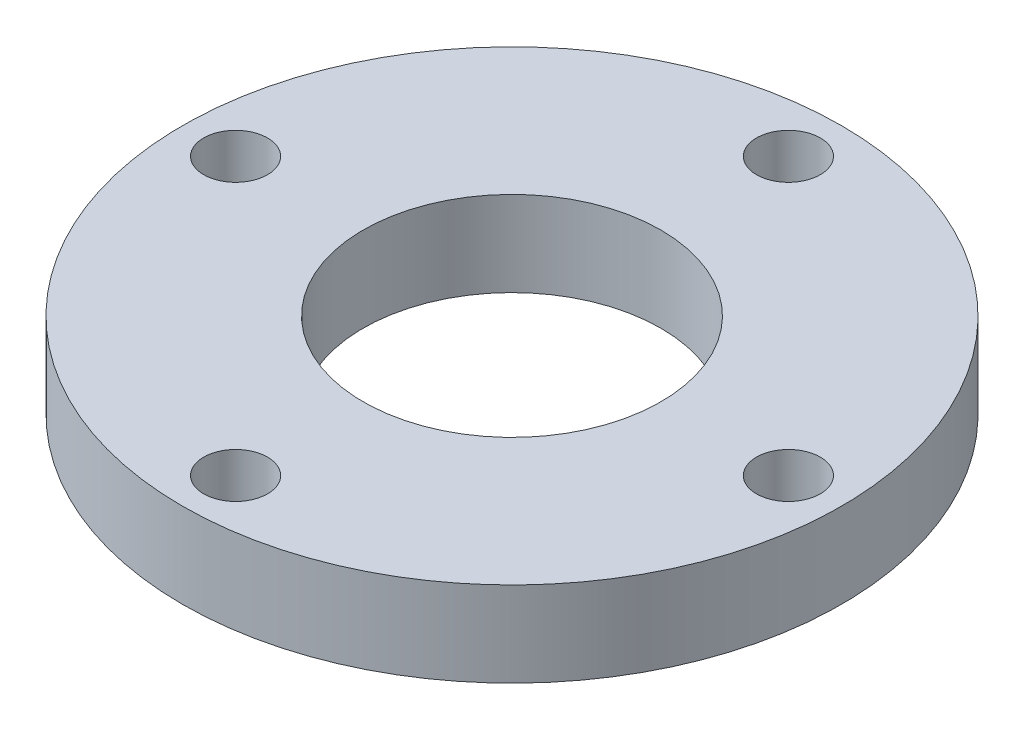
ISO-10303-21;
HEADER;
FILE_DESCRIPTION(('STEP AP214'),'2;1');
FILE_NAME('part.step','',(''),(''),'','','');
FILE_SCHEMA(('AUTOMOTIVE_DESIGN { 1 0 10303 214 1 1 1 1 }'));
ENDSEC;
DATA;
#1=APPLICATION_CONTEXT('core data for automotive mechanical design processes');
#2=APPLICATION_PROTOCOL_DEFINITION('international standard','automotive_design',2000,#1);
#3=PRODUCT_CONTEXT('',#1,'mechanical');
#4=PRODUCT('Part','Part','',(#3));
#5=PRODUCT_RELATED_PRODUCT_CATEGORY('part','',(#4));
#6=PRODUCT_DEFINITION_FORMATION('','',#4);
#7=PRODUCT_DEFINITION_CONTEXT('part definition',#1,'design');
#8=PRODUCT_DEFINITION('design','',#6,#7);
#9=PRODUCT_DEFINITION_SHAPE('','',#8);
#10=(LENGTH_UNIT() NAMED_UNIT(*) SI_UNIT(.MILLI.,.METRE.));
#11=(NAMED_UNIT(*) PLANE_ANGLE_UNIT() SI_UNIT($,.RADIAN.));
#12=(NAMED_UNIT(*) SI_UNIT($,.STERADIAN.) SOLID_ANGLE_UNIT());
#13=UNCERTAINTY_MEASURE_WITH_UNIT(LENGTH_MEASURE(1.E-05),#10,'distance_accuracy_value','');
#14=(GEOMETRIC_REPRESENTATION_CONTEXT(3) GLOBAL_UNCERTAINTY_ASSIGNED_CONTEXT((#13)) GLOBAL_UNIT_ASSIGNED_CONTEXT((#10,
#11,#12)) REPRESENTATION_CONTEXT('',''));
#15=CARTESIAN_POINT('',(0.,0.,0.));
#16=DIRECTION('',(0.,0.,1.));
#17=DIRECTION('',(1.,0.,0.));
#18=AXIS2_PLACEMENT_3D('',#15,#16,#17);
#19=CARTESIAN_POINT('',(0.,4.,0.));
#20=DIRECTION('',(0.,-1.,0.));
#21=DIRECTION('',(0.,0.,-1.));
#22=AXIS2_PLACEMENT_3D('',#19,#20,#21);
#23=CYLINDRICAL_SURFACE('',#22,15.5);
#24=CARTESIAN_POINT('',(0.,4.,0.));
#25=DIRECTION('',(0.,1.,0.));
#26=DIRECTION('',(0.,0.,1.));
#27=AXIS2_PLACEMENT_3D('',#24,#25,#26);
#28=CIRCLE('',#27,15.5);
#29=CARTESIAN_POINT('',(0.,4.,15.5));
#30=VERTEX_POINT('',#29);
#31=EDGE_CURVE('E10',#30,#30,#28,.T.);
#32=ORIENTED_EDGE('',*,*,#31,.F.);
#33=EDGE_LOOP('',(#32));
#34=FACE_BOUND('',#33,.T.);
#35=CARTESIAN_POINT('',(0.,0.,0.));
#36=DIRECTION('',(0.,1.,0.));
#37=DIRECTION('',(0.,0.,1.));
#38=AXIS2_PLACEMENT_3D('',#35,#36,#37);
#39=CIRCLE('',#38,15.5);
#40=CARTESIAN_POINT('',(0.,0.,15.5));
#41=VERTEX_POINT('',#40);
#42=EDGE_CURVE('E35',#41,#41,#39,.T.);
#43=ORIENTED_EDGE('',*,*,#42,.T.);
#44=EDGE_LOOP('',(#43));
#45=FACE_BOUND('',#44,.T.);
#46=ADVANCED_FACE('F32',(#34,#45),#23,.T.);
#47=CARTESIAN_POINT('',(0.,4.,0.));
#48=DIRECTION('',(0.,1.,0.));
#49=DIRECTION('',(0.,0.,1.));
#50=AXIS2_PLACEMENT_3D('',#47,#48,#49);
#51=PLANE('',#50);
#52=CARTESIAN_POINT('',(-13.,4.,0.));
#53=DIRECTION('',(0.,-1.,0.));
#54=DIRECTION('',(1.,0.,0.));
#55=AXIS2_PLACEMENT_3D('',#52,#53,#54);
#56=CIRCLE('',#55,1.5);
#57=CARTESIAN_POINT('',(-11.5,4.,0.));
#58=VERTEX_POINT('',#57);
#59=EDGE_CURVE('E53',#58,#58,#56,.T.);
#60=ORIENTED_EDGE('',*,*,#59,.T.);
#61=EDGE_LOOP('',(#60));
#62=FACE_BOUND('',#61,.T.);
#63=CARTESIAN_POINT('',(0.,4.,-13.));
#64=DIRECTION('',(0.,-1.,0.));
#65=DIRECTION('',(0.,0.,1.));
#66=AXIS2_PLACEMENT_3D('',#63,#64,#65);
#67=CIRCLE('',#66,1.5);
#68=CARTESIAN_POINT('',(0.,4.,-11.5));
#69=VERTEX_POINT('',#68);
#70=EDGE_CURVE('E65',#69,#69,#67,.T.);
#71=ORIENTED_EDGE('',*,*,#70,.T.);
#72=EDGE_LOOP('',(#71));
#73=FACE_BOUND('',#72,.T.);
#74=CARTESIAN_POINT('',(13.,4.,1.36167772214882E-13));
#75=DIRECTION('',(0.,-1.,0.));
#76=DIRECTION('',(-1.,0.,0.));
#77=AXIS2_PLACEMENT_3D('',#74,#75,#76);
#78=CIRCLE('',#77,1.5);
#79=CARTESIAN_POINT('',(11.5,4.,1.20456106190088E-13));
#80=VERTEX_POINT('',#79);
#81=EDGE_CURVE('E59',#80,#80,#78,.T.);
#82=ORIENTED_EDGE('',*,*,#81,.T.);
#83=EDGE_LOOP('',(#82));
#84=FACE_BOUND('',#83,.T.);
#85=CARTESIAN_POINT('',(0.,4.,13.));
#86=DIRECTION('',(0.,-1.,0.));
#87=DIRECTION('',(0.,0.,-1.));
#88=AXIS2_PLACEMENT_3D('',#85,#86,#87);
#89=CIRCLE('',#88,1.5);
#90=CARTESIAN_POINT('',(0.,4.,11.5));
#91=VERTEX_POINT('',#90);
#92=EDGE_CURVE('E47',#91,#91,#89,.T.);
#93=ORIENTED_EDGE('',*,*,#92,.T.);
#94=EDGE_LOOP('',(#93));
#95=FACE_BOUND('',#94,.T.);
#96=CARTESIAN_POINT('',(0.,4.,0.));
#97=DIRECTION('',(0.,-1.,0.));
#98=DIRECTION('',(0.,0.,-1.));
#99=AXIS2_PLACEMENT_3D('',#96,#97,#98);
#100=CIRCLE('',#99,7.);
#101=CARTESIAN_POINT('',(0.,4.,-7.));
#102=VERTEX_POINT('',#101);
#103=EDGE_CURVE('E42',#102,#102,#100,.T.);
#104=ORIENTED_EDGE('',*,*,#103,.T.);
#105=EDGE_LOOP('',(#104));
#106=FACE_BOUND('',#105,.T.);
#107=ORIENTED_EDGE('',*,*,#31,.T.);
#108=EDGE_LOOP('',(#107));
#109=FACE_BOUND('',#108,.T.);
#110=ADVANCED_FACE('F74',(#62,#73,#84,#95,#106,#109),#51,.T.);
#111=CARTESIAN_POINT('',(0.,0.,0.));
#112=DIRECTION('',(0.,1.,0.));
#113=DIRECTION('',(0.,0.,1.));
#114=AXIS2_PLACEMENT_3D('',#111,#112,#113);
#115=PLANE('',#114);
#116=CARTESIAN_POINT('',(-13.,0.,0.));
#117=DIRECTION('',(0.,-1.,0.));
#118=DIRECTION('',(1.,0.,0.));
#119=AXIS2_PLACEMENT_3D('',#116,#117,#118);
#120=CIRCLE('',#119,1.5);
#121=CARTESIAN_POINT('',(-11.5,0.,0.));
#122=VERTEX_POINT('',#121);
#123=EDGE_CURVE('E68',#122,#122,#120,.T.);
#124=ORIENTED_EDGE('',*,*,#123,.F.);
#125=EDGE_LOOP('',(#124));
#126=FACE_BOUND('',#125,.T.);
#127=CARTESIAN_POINT('',(0.,0.,-13.));
#128=DIRECTION('',(0.,-1.,0.));
#129=DIRECTION('',(0.,0.,1.));
#130=AXIS2_PLACEMENT_3D('',#127,#128,#129);
#131=CIRCLE('',#130,1.5);
#132=CARTESIAN_POINT('',(0.,0.,-11.5));
#133=VERTEX_POINT('',#132);
#134=EDGE_CURVE('E62',#133,#133,#131,.T.);
#135=ORIENTED_EDGE('',*,*,#134,.F.);
#136=EDGE_LOOP('',(#135));
#137=FACE_BOUND('',#136,.T.);
#138=CARTESIAN_POINT('',(13.,0.,1.36167772214882E-13));
#139=DIRECTION('',(0.,-1.,0.));
#140=DIRECTION('',(-1.,0.,0.));
#141=AXIS2_PLACEMENT_3D('',#138,#139,#140);
#142=CIRCLE('',#141,1.5);
#143=CARTESIAN_POINT('',(11.5,0.,1.20456106190088E-13));
#144=VERTEX_POINT('',#143);
#145=EDGE_CURVE('E56',#144,#144,#142,.T.);
#146=ORIENTED_EDGE('',*,*,#145,.F.);
#147=EDGE_LOOP('',(#146));
#148=FACE_BOUND('',#147,.T.);
#149=CARTESIAN_POINT('',(0.,0.,13.));
#150=DIRECTION('',(0.,-1.,0.));
#151=DIRECTION('',(0.,0.,-1.));
#152=AXIS2_PLACEMENT_3D('',#149,#150,#151);
#153=CIRCLE('',#152,1.5);
#154=CARTESIAN_POINT('',(0.,0.,11.5));
#155=VERTEX_POINT('',#154);
#156=EDGE_CURVE('E50',#155,#155,#153,.T.);
#157=ORIENTED_EDGE('',*,*,#156,.F.);
#158=EDGE_LOOP('',(#157));
#159=FACE_BOUND('',#158,.T.);
#160=CARTESIAN_POINT('',(0.,0.,0.));
#161=DIRECTION('',(0.,-1.,0.));
#162=DIRECTION('',(0.,0.,-1.));
#163=AXIS2_PLACEMENT_3D('',#160,#161,#162);
#164=CIRCLE('',#163,7.);
#165=CARTESIAN_POINT('',(0.,0.,-7.));
#166=VERTEX_POINT('',#165);
#167=EDGE_CURVE('E44',#166,#166,#164,.T.);
#168=ORIENTED_EDGE('',*,*,#167,.F.);
#169=EDGE_LOOP('',(#168));
#170=FACE_BOUND('',#169,.T.);
#171=ORIENTED_EDGE('',*,*,#42,.F.);
#172=EDGE_LOOP('',(#171));
#173=FACE_BOUND('',#172,.T.);
#174=ADVANCED_FACE('F84',(#126,#137,#148,#159,#170,#173),#115,.F.);
#175=CARTESIAN_POINT('',(0.,4.,0.));
#176=DIRECTION('',(0.,-1.,0.));
#177=DIRECTION('',(0.,0.,-1.));
#178=AXIS2_PLACEMENT_3D('',#175,#176,#177);
#179=CYLINDRICAL_SURFACE('',#178,7.);
#180=ORIENTED_EDGE('',*,*,#103,.F.);
#181=EDGE_LOOP('',(#180));
#182=FACE_BOUND('',#181,.T.);
#183=ORIENTED_EDGE('',*,*,#167,.T.);
#184=EDGE_LOOP('',(#183));
#185=FACE_BOUND('',#184,.T.);
#186=ADVANCED_FACE('F87',(#182,#185),#179,.F.);
#187=CARTESIAN_POINT('',(0.,4.,13.));
#188=DIRECTION('',(0.,-1.,0.));
#189=DIRECTION('',(0.,0.,-1.));
#190=AXIS2_PLACEMENT_3D('',#187,#188,#189);
#191=CYLINDRICAL_SURFACE('',#190,1.5);
#192=ORIENTED_EDGE('',*,*,#92,.F.);
#193=EDGE_LOOP('',(#192));
#194=FACE_BOUND('',#193,.T.);
#195=ORIENTED_EDGE('',*,*,#156,.T.);
#196=EDGE_LOOP('',(#195));
#197=FACE_BOUND('',#196,.T.);
#198=ADVANCED_FACE('F109',(#194,#197),#191,.F.);
#199=CARTESIAN_POINT('',(13.,4.,1.36167772214882E-13));
#200=DIRECTION('',(0.,-1.,0.));
#201=DIRECTION('',(0.,0.,-1.));
#202=AXIS2_PLACEMENT_3D('',#199,#200,#201);
#203=CYLINDRICAL_SURFACE('',#202,1.5);
#204=ORIENTED_EDGE('',*,*,#81,.F.);
#205=EDGE_LOOP('',(#204));
#206=FACE_BOUND('',#205,.T.);
#207=ORIENTED_EDGE('',*,*,#145,.T.);
#208=EDGE_LOOP('',(#207));
#209=FACE_BOUND('',#208,.T.);
#210=ADVANCED_FACE('F113',(#206,#209),#203,.F.);
#211=CARTESIAN_POINT('',(0.,4.,-13.));
#212=DIRECTION('',(0.,-1.,0.));
#213=DIRECTION('',(0.,0.,-1.));
#214=AXIS2_PLACEMENT_3D('',#211,#212,#213);
#215=CYLINDRICAL_SURFACE('',#214,1.5);
#216=ORIENTED_EDGE('',*,*,#70,.F.);
#217=EDGE_LOOP('',(#216));
#218=FACE_BOUND('',#217,.T.);
#219=ORIENTED_EDGE('',*,*,#134,.T.);
#220=EDGE_LOOP('',(#219));
#221=FACE_BOUND('',#220,.T.);
#222=ADVANCED_FACE('F80',(#218,#221),#215,.F.);
#223=CARTESIAN_POINT('',(-13.,4.,0.));
#224=DIRECTION('',(0.,-1.,0.));
#225=DIRECTION('',(0.,0.,-1.));
#226=AXIS2_PLACEMENT_3D('',#223,#224,#225);
#227=CYLINDRICAL_SURFACE('',#226,1.5);
#228=ORIENTED_EDGE('',*,*,#59,.F.);
#229=EDGE_LOOP('',(#228));
#230=FACE_BOUND('',#229,.T.);
#231=ORIENTED_EDGE('',*,*,#123,.T.);
#232=EDGE_LOOP('',(#231));
#233=FACE_BOUND('',#232,.T.);
#234=ADVANCED_FACE('F77',(#230,#233),#227,.F.);
#235=CLOSED_SHELL('',(#46,#110,#174,#186,#198,#210,#222,#234));
#236=MANIFOLD_SOLID_BREP('B2',#235);
#237=ADVANCED_BREP_SHAPE_REPRESENTATION('',(#18,#236),#14);
#238=SHAPE_DEFINITION_REPRESENTATION(#9,#237);
ENDSEC;
END-ISO-10303-21;
